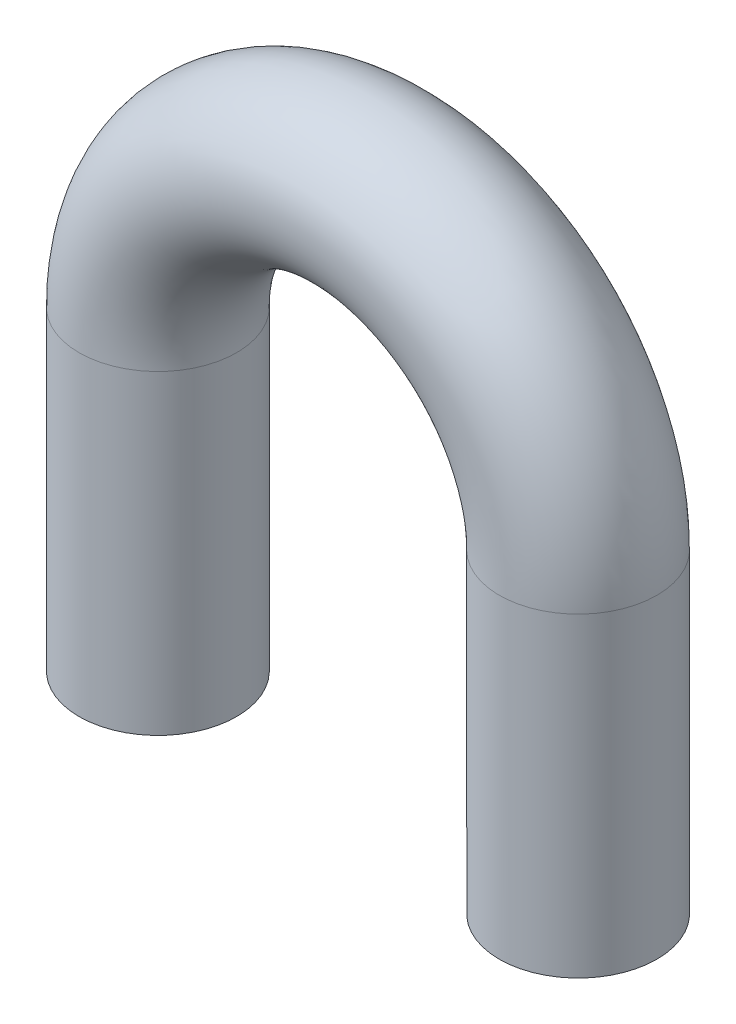
ISO-10303-21;
HEADER;
FILE_DESCRIPTION(('STEP AP214'),'2;1');
FILE_NAME('part.step','',(''),(''),'','','');
FILE_SCHEMA(('AUTOMOTIVE_DESIGN { 1 0 10303 214 1 1 1 1 }'));
ENDSEC;
DATA;
#1=APPLICATION_CONTEXT('core data for automotive mechanical design processes');
#2=APPLICATION_PROTOCOL_DEFINITION('international standard','automotive_design',2000,#1);
#3=PRODUCT_CONTEXT('',#1,'mechanical');
#4=PRODUCT('Part','Part','',(#3));
#5=PRODUCT_RELATED_PRODUCT_CATEGORY('part','',(#4));
#6=PRODUCT_DEFINITION_FORMATION('','',#4);
#7=PRODUCT_DEFINITION_CONTEXT('part definition',#1,'design');
#8=PRODUCT_DEFINITION('design','',#6,#7);
#9=PRODUCT_DEFINITION_SHAPE('','',#8);
#10=(LENGTH_UNIT() NAMED_UNIT(*) SI_UNIT(.MILLI.,.METRE.));
#11=(NAMED_UNIT(*) PLANE_ANGLE_UNIT() SI_UNIT($,.RADIAN.));
#12=(NAMED_UNIT(*) SI_UNIT($,.STERADIAN.) SOLID_ANGLE_UNIT());
#13=UNCERTAINTY_MEASURE_WITH_UNIT(LENGTH_MEASURE(1.E-05),#10,'distance_accuracy_value','');
#14=(GEOMETRIC_REPRESENTATION_CONTEXT(3) GLOBAL_UNCERTAINTY_ASSIGNED_CONTEXT((#13)) GLOBAL_UNIT_ASSIGNED_CONTEXT((#10,
#11,#12)) REPRESENTATION_CONTEXT('',''));
#15=CARTESIAN_POINT('',(0.,0.,0.));
#16=DIRECTION('',(0.,0.,1.));
#17=DIRECTION('',(1.,0.,0.));
#18=AXIS2_PLACEMENT_3D('',#15,#16,#17);
#19=CARTESIAN_POINT('',(-20.,0.,0.));
#20=DIRECTION('',(0.,1.,0.));
#21=DIRECTION('',(0.,0.,1.));
#22=AXIS2_PLACEMENT_3D('',#19,#20,#21);
#23=PLANE('',#22);
#24=CARTESIAN_POINT('',(-20.,0.,0.));
#25=DIRECTION('',(0.,1.,0.));
#26=DIRECTION('',(0.,0.,1.));
#27=AXIS2_PLACEMENT_3D('',#24,#25,#26);
#28=CIRCLE('',#27,7.5);
#29=CARTESIAN_POINT('',(-20.,0.,7.5));
#30=VERTEX_POINT('',#29);
#31=EDGE_CURVE('E58',#30,#30,#28,.T.);
#32=ORIENTED_EDGE('',*,*,#31,.F.);
#33=EDGE_LOOP('',(#32));
#34=FACE_BOUND('',#33,.T.);
#35=ADVANCED_FACE('F41',(#34),#23,.F.);
#36=CARTESIAN_POINT('',(20.,0.,0.));
#37=DIRECTION('',(0.,-1.,0.));
#38=DIRECTION('',(0.,0.,1.));
#39=AXIS2_PLACEMENT_3D('',#36,#37,#38);
#40=PLANE('',#39);
#41=CARTESIAN_POINT('',(20.,0.,0.));
#42=DIRECTION('',(0.,-1.,0.));
#43=DIRECTION('',(0.,0.,1.));
#44=AXIS2_PLACEMENT_3D('',#41,#42,#43);
#45=CIRCLE('',#44,7.5);
#46=CARTESIAN_POINT('',(20.,0.,7.5));
#47=VERTEX_POINT('',#46);
#48=EDGE_CURVE('E10',#47,#47,#45,.T.);
#49=ORIENTED_EDGE('',*,*,#48,.T.);
#50=EDGE_LOOP('',(#49));
#51=FACE_BOUND('',#50,.T.);
#52=ADVANCED_FACE('F68',(#51),#40,.T.);
#53=CARTESIAN_POINT('',(-20.,0.,0.));
#54=DIRECTION('',(0.,1.,0.));
#55=DIRECTION('',(0.,0.,1.));
#56=AXIS2_PLACEMENT_3D('',#53,#54,#55);
#57=CYLINDRICAL_SURFACE('',#56,7.5);
#58=CARTESIAN_POINT('',(-20.,30.,0.));
#59=DIRECTION('',(0.,1.,0.));
#60=DIRECTION('',(0.,0.,1.));
#61=AXIS2_PLACEMENT_3D('',#58,#59,#60);
#62=CIRCLE('',#61,7.5);
#63=CARTESIAN_POINT('',(-27.5,30.,0.));
#64=VERTEX_POINT('',#63);
#65=EDGE_CURVE('E53',#64,#64,#62,.T.);
#66=ORIENTED_EDGE('',*,*,#65,.F.);
#67=EDGE_LOOP('',(#66));
#68=FACE_BOUND('',#67,.T.);
#69=ORIENTED_EDGE('',*,*,#31,.T.);
#70=EDGE_LOOP('',(#69));
#71=FACE_BOUND('',#70,.T.);
#72=ADVANCED_FACE('F65',(#68,#71),#57,.T.);
#73=CARTESIAN_POINT('',(0.,30.,0.));
#74=DIRECTION('',(0.,0.,-1.));
#75=DIRECTION('',(-1.,0.,0.));
#76=AXIS2_PLACEMENT_3D('',#73,#74,#75);
#77=TOROIDAL_SURFACE('',#76,20.,7.5);
#78=CARTESIAN_POINT('',(20.,30.,0.));
#79=DIRECTION('',(0.,-1.,0.));
#80=DIRECTION('',(0.,0.,1.));
#81=AXIS2_PLACEMENT_3D('',#78,#79,#80);
#82=CIRCLE('',#81,7.5);
#83=CARTESIAN_POINT('',(27.5,30.,0.));
#84=VERTEX_POINT('',#83);
#85=EDGE_CURVE('E48',#84,#84,#82,.T.);
#86=CARTESIAN_POINT('',(0.,30.,0.));
#87=DIRECTION('',(0.,0.,-1.));
#88=DIRECTION('',(-1.,0.,0.));
#89=AXIS2_PLACEMENT_3D('',#86,#87,#88);
#90=CIRCLE('',#89,27.5);
#91=EDGE_CURVE('',#64,#84,#90,.T.);
#92=ORIENTED_EDGE('',*,*,#65,.T.);
#93=ORIENTED_EDGE('',*,*,#85,.F.);
#94=ORIENTED_EDGE('',*,*,#91,.T.);
#95=ORIENTED_EDGE('',*,*,#91,.F.);
#96=EDGE_LOOP('',(#92,#94,#93,#95));
#97=FACE_BOUND('',#96,.T.);
#98=ADVANCED_FACE('F74',(#97),#77,.T.);
#99=CARTESIAN_POINT('',(20.,30.,0.));
#100=DIRECTION('',(0.,-1.,0.));
#101=DIRECTION('',(1.,0.,0.));
#102=AXIS2_PLACEMENT_3D('',#99,#100,#101);
#103=CYLINDRICAL_SURFACE('',#102,7.5);
#104=ORIENTED_EDGE('',*,*,#48,.F.);
#105=EDGE_LOOP('',(#104));
#106=FACE_BOUND('',#105,.T.);
#107=ORIENTED_EDGE('',*,*,#85,.T.);
#108=EDGE_LOOP('',(#107));
#109=FACE_BOUND('',#108,.T.);
#110=ADVANCED_FACE('F72',(#106,#109),#103,.T.);
#111=CLOSED_SHELL('',(#35,#52,#72,#98,#110));
#112=MANIFOLD_SOLID_BREP('B2',#111);
#113=ADVANCED_BREP_SHAPE_REPRESENTATION('',(#18,#112),#14);
#114=SHAPE_DEFINITION_REPRESENTATION(#9,#113);
ENDSEC;
END-ISO-10303-21;
